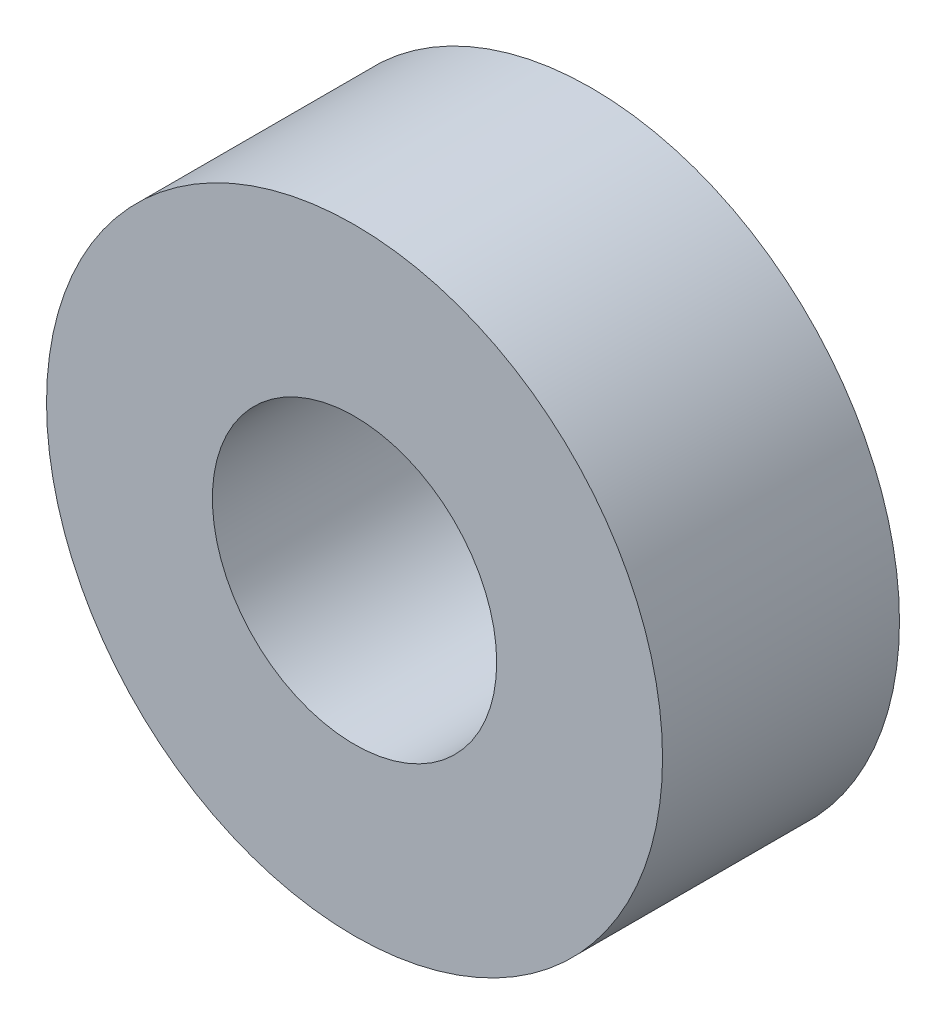
ISO-10303-21;
HEADER;
FILE_DESCRIPTION(('STEP AP214'),'2;1');
FILE_NAME('part.step','',(''),(''),'','','');
FILE_SCHEMA(('AUTOMOTIVE_DESIGN { 1 0 10303 214 1 1 1 1 }'));
ENDSEC;
DATA;
#1=APPLICATION_CONTEXT('core data for automotive mechanical design processes');
#2=APPLICATION_PROTOCOL_DEFINITION('international standard','automotive_design',2000,#1);
#3=PRODUCT_CONTEXT('',#1,'mechanical');
#4=PRODUCT('Part','Part','',(#3));
#5=PRODUCT_RELATED_PRODUCT_CATEGORY('part','',(#4));
#6=PRODUCT_DEFINITION_FORMATION('','',#4);
#7=PRODUCT_DEFINITION_CONTEXT('part definition',#1,'design');
#8=PRODUCT_DEFINITION('design','',#6,#7);
#9=PRODUCT_DEFINITION_SHAPE('','',#8);
#10=(LENGTH_UNIT() NAMED_UNIT(*) SI_UNIT(.MILLI.,.METRE.));
#11=(NAMED_UNIT(*) PLANE_ANGLE_UNIT() SI_UNIT($,.RADIAN.));
#12=(NAMED_UNIT(*) SI_UNIT($,.STERADIAN.) SOLID_ANGLE_UNIT());
#13=UNCERTAINTY_MEASURE_WITH_UNIT(LENGTH_MEASURE(1.E-05),#10,'distance_accuracy_value','');
#14=(GEOMETRIC_REPRESENTATION_CONTEXT(3) GLOBAL_UNCERTAINTY_ASSIGNED_CONTEXT((#13)) GLOBAL_UNIT_ASSIGNED_CONTEXT((#10,
#11,#12)) REPRESENTATION_CONTEXT('',''));
#15=CARTESIAN_POINT('',(0.,0.,0.));
#16=DIRECTION('',(0.,0.,1.));
#17=DIRECTION('',(1.,0.,0.));
#18=AXIS2_PLACEMENT_3D('',#15,#16,#17);
#19=CARTESIAN_POINT('',(0.,0.,5.));
#20=DIRECTION('',(0.,0.,1.));
#21=DIRECTION('',(1.,0.,0.));
#22=AXIS2_PLACEMENT_3D('',#19,#20,#21);
#23=PLANE('',#22);
#24=CARTESIAN_POINT('',(0.,0.,5.));
#25=DIRECTION('',(0.,0.,1.));
#26=DIRECTION('',(1.,0.,0.));
#27=AXIS2_PLACEMENT_3D('',#24,#25,#26);
#28=CIRCLE('',#27,6.5);
#29=CARTESIAN_POINT('',(6.5,0.,5.));
#30=VERTEX_POINT('',#29);
#31=EDGE_CURVE('E10',#30,#30,#28,.T.);
#32=ORIENTED_EDGE('',*,*,#31,.T.);
#33=EDGE_LOOP('',(#32));
#34=FACE_BOUND('',#33,.T.);
#35=CARTESIAN_POINT('',(0.,0.,5.));
#36=DIRECTION('',(0.,0.,1.));
#37=DIRECTION('',(1.,0.,0.));
#38=AXIS2_PLACEMENT_3D('',#35,#36,#37);
#39=CIRCLE('',#38,3.);
#40=CARTESIAN_POINT('',(3.,0.,5.));
#41=VERTEX_POINT('',#40);
#42=EDGE_CURVE('E51',#41,#41,#39,.T.);
#43=ORIENTED_EDGE('',*,*,#42,.F.);
#44=EDGE_LOOP('',(#43));
#45=FACE_BOUND('',#44,.T.);
#46=ADVANCED_FACE('F40',(#34,#45),#23,.T.);
#47=CARTESIAN_POINT('',(0.,0.,0.));
#48=DIRECTION('',(0.,0.,1.));
#49=DIRECTION('',(1.,0.,0.));
#50=AXIS2_PLACEMENT_3D('',#47,#48,#49);
#51=PLANE('',#50);
#52=CARTESIAN_POINT('',(0.,0.,0.));
#53=DIRECTION('',(0.,0.,1.));
#54=DIRECTION('',(1.,0.,0.));
#55=AXIS2_PLACEMENT_3D('',#52,#53,#54);
#56=CIRCLE('',#55,6.5);
#57=CARTESIAN_POINT('',(6.5,0.,0.));
#58=VERTEX_POINT('',#57);
#59=EDGE_CURVE('E44',#58,#58,#56,.T.);
#60=ORIENTED_EDGE('',*,*,#59,.F.);
#61=EDGE_LOOP('',(#60));
#62=FACE_BOUND('',#61,.T.);
#63=CARTESIAN_POINT('',(0.,0.,0.));
#64=DIRECTION('',(0.,0.,1.));
#65=DIRECTION('',(1.,0.,0.));
#66=AXIS2_PLACEMENT_3D('',#63,#64,#65);
#67=CIRCLE('',#66,3.);
#68=CARTESIAN_POINT('',(3.,0.,0.));
#69=VERTEX_POINT('',#68);
#70=EDGE_CURVE('E53',#69,#69,#67,.T.);
#71=ORIENTED_EDGE('',*,*,#70,.T.);
#72=EDGE_LOOP('',(#71));
#73=FACE_BOUND('',#72,.T.);
#74=ADVANCED_FACE('F63',(#62,#73),#51,.F.);
#75=CARTESIAN_POINT('',(0.,0.,5.));
#76=DIRECTION('',(0.,0.,-1.));
#77=DIRECTION('',(-1.,0.,0.));
#78=AXIS2_PLACEMENT_3D('',#75,#76,#77);
#79=CYLINDRICAL_SURFACE('',#78,6.5);
#80=ORIENTED_EDGE('',*,*,#31,.F.);
#81=EDGE_LOOP('',(#80));
#82=FACE_BOUND('',#81,.T.);
#83=ORIENTED_EDGE('',*,*,#59,.T.);
#84=EDGE_LOOP('',(#83));
#85=FACE_BOUND('',#84,.T.);
#86=ADVANCED_FACE('F42',(#82,#85),#79,.T.);
#87=CARTESIAN_POINT('',(0.,0.,5.));
#88=DIRECTION('',(0.,0.,-1.));
#89=DIRECTION('',(-1.,0.,0.));
#90=AXIS2_PLACEMENT_3D('',#87,#88,#89);
#91=CYLINDRICAL_SURFACE('',#90,3.);
#92=ORIENTED_EDGE('',*,*,#42,.T.);
#93=EDGE_LOOP('',(#92));
#94=FACE_BOUND('',#93,.T.);
#95=ORIENTED_EDGE('',*,*,#70,.F.);
#96=EDGE_LOOP('',(#95));
#97=FACE_BOUND('',#96,.T.);
#98=ADVANCED_FACE('F59',(#94,#97),#91,.F.);
#99=CLOSED_SHELL('',(#46,#74,#86,#98));
#100=MANIFOLD_SOLID_BREP('B2',#99);
#101=ADVANCED_BREP_SHAPE_REPRESENTATION('',(#18,#100),#14);
#102=SHAPE_DEFINITION_REPRESENTATION(#9,#101);
ENDSEC;
END-ISO-10303-21;
